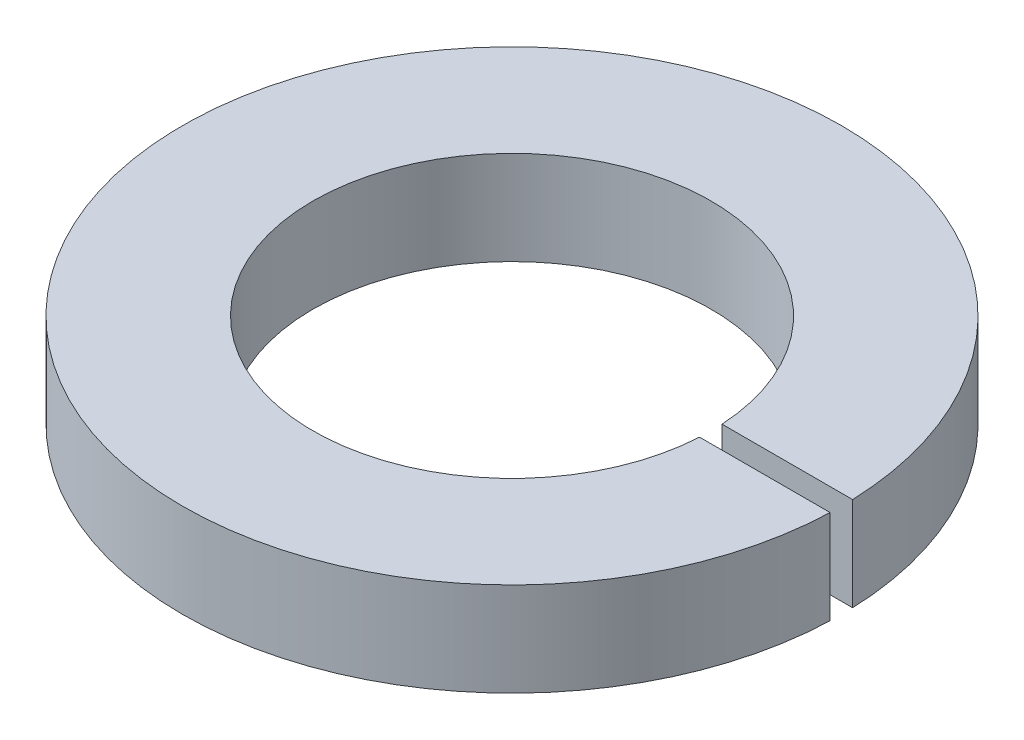
ISO-10303-21;
HEADER;
FILE_DESCRIPTION(('STEP AP214'),'2;1');
FILE_NAME('part.step','',(''),(''),'','','');
FILE_SCHEMA(('AUTOMOTIVE_DESIGN { 1 0 10303 214 1 1 1 1 }'));
ENDSEC;
DATA;
#1=APPLICATION_CONTEXT('core data for automotive mechanical design processes');
#2=APPLICATION_PROTOCOL_DEFINITION('international standard','automotive_design',2000,#1);
#3=PRODUCT_CONTEXT('',#1,'mechanical');
#4=PRODUCT('Part','Part','',(#3));
#5=PRODUCT_RELATED_PRODUCT_CATEGORY('part','',(#4));
#6=PRODUCT_DEFINITION_FORMATION('','',#4);
#7=PRODUCT_DEFINITION_CONTEXT('part definition',#1,'design');
#8=PRODUCT_DEFINITION('design','',#6,#7);
#9=PRODUCT_DEFINITION_SHAPE('','',#8);
#10=(LENGTH_UNIT() NAMED_UNIT(*) SI_UNIT(.MILLI.,.METRE.));
#11=(NAMED_UNIT(*) PLANE_ANGLE_UNIT() SI_UNIT($,.RADIAN.));
#12=(NAMED_UNIT(*) SI_UNIT($,.STERADIAN.) SOLID_ANGLE_UNIT());
#13=UNCERTAINTY_MEASURE_WITH_UNIT(LENGTH_MEASURE(1.E-05),#10,'distance_accuracy_value','');
#14=(GEOMETRIC_REPRESENTATION_CONTEXT(3) GLOBAL_UNCERTAINTY_ASSIGNED_CONTEXT((#13)) GLOBAL_UNIT_ASSIGNED_CONTEXT((#10,
#11,#12)) REPRESENTATION_CONTEXT('',''));
#15=CARTESIAN_POINT('',(0.,0.,0.));
#16=DIRECTION('',(0.,0.,1.));
#17=DIRECTION('',(1.,0.,0.));
#18=AXIS2_PLACEMENT_3D('',#15,#16,#17);
#19=CARTESIAN_POINT('',(0.,3.175,0.));
#20=DIRECTION('',(0.,1.,0.));
#21=DIRECTION('',(0.,0.,1.));
#22=AXIS2_PLACEMENT_3D('',#19,#20,#21);
#23=PLANE('',#22);
#24=CARTESIAN_POINT('',(0.,3.175,0.));
#25=DIRECTION('',(0.,1.,0.));
#26=DIRECTION('',(0.,0.,1.));
#27=AXIS2_PLACEMENT_3D('',#24,#25,#26);
#28=CIRCLE('',#27,11.1633);
#29=CARTESIAN_POINT('',(11.1567963990565,3.175,-0.380999999999999));
#30=VERTEX_POINT('',#29);
#31=CARTESIAN_POINT('',(11.1567963990565,3.175,0.381));
#32=VERTEX_POINT('',#31);
#33=EDGE_CURVE('E88',#30,#32,#28,.T.);
#34=ORIENTED_EDGE('',*,*,#33,.T.);
#35=DIRECTION('',(-1.,0.,0.));
#36=VECTOR('',#35,1.);
#37=CARTESIAN_POINT('',(11.1567963990565,3.175,0.381000000000001));
#38=LINE('',#37,#36);
#39=CARTESIAN_POINT('',(6.73292868594344,3.175,0.381000000000001));
#40=VERTEX_POINT('',#39);
#41=EDGE_CURVE('E101',#32,#40,#38,.T.);
#42=ORIENTED_EDGE('',*,*,#41,.T.);
#43=CARTESIAN_POINT('',(0.,3.175,0.));
#44=DIRECTION('',(0.,1.,0.));
#45=DIRECTION('',(0.,0.,1.));
#46=AXIS2_PLACEMENT_3D('',#43,#44,#45);
#47=CIRCLE('',#46,6.7437);
#48=CARTESIAN_POINT('',(6.73292868594344,3.175,-0.381));
#49=VERTEX_POINT('',#48);
#50=EDGE_CURVE('E92',#49,#40,#47,.T.);
#51=ORIENTED_EDGE('',*,*,#50,.F.);
#52=DIRECTION('',(-1.,0.,0.));
#53=VECTOR('',#52,1.);
#54=CARTESIAN_POINT('',(11.1567963990565,3.175,-0.380999999999999));
#55=LINE('',#54,#53);
#56=EDGE_CURVE('E56',#30,#49,#55,.T.);
#57=ORIENTED_EDGE('',*,*,#56,.F.);
#58=EDGE_LOOP('',(#34,#42,#51,#57));
#59=FACE_BOUND('',#58,.T.);
#60=ADVANCED_FACE('F34',(#59),#23,.T.);
#61=CARTESIAN_POINT('',(0.,0.,0.));
#62=DIRECTION('',(0.,1.,0.));
#63=DIRECTION('',(0.,0.,1.));
#64=AXIS2_PLACEMENT_3D('',#61,#62,#63);
#65=PLANE('',#64);
#66=DIRECTION('',(-1.,0.,0.));
#67=VECTOR('',#66,1.);
#68=CARTESIAN_POINT('',(11.1567963990565,0.,0.381000000000001));
#69=LINE('',#68,#67);
#70=CARTESIAN_POINT('',(11.1567963990565,0.,0.381));
#71=VERTEX_POINT('',#70);
#72=CARTESIAN_POINT('',(6.73292868594344,0.,0.381000000000001));
#73=VERTEX_POINT('',#72);
#74=EDGE_CURVE('E49',#71,#73,#69,.T.);
#75=ORIENTED_EDGE('',*,*,#74,.F.);
#76=CARTESIAN_POINT('',(0.,0.,0.));
#77=DIRECTION('',(0.,1.,0.));
#78=DIRECTION('',(0.,0.,1.));
#79=AXIS2_PLACEMENT_3D('',#76,#77,#78);
#80=CIRCLE('',#79,11.1633);
#81=CARTESIAN_POINT('',(11.1567963990565,0.,-0.380999999999999));
#82=VERTEX_POINT('',#81);
#83=EDGE_CURVE('E86',#82,#71,#80,.T.);
#84=ORIENTED_EDGE('',*,*,#83,.F.);
#85=DIRECTION('',(-1.,0.,0.));
#86=VECTOR('',#85,1.);
#87=CARTESIAN_POINT('',(11.1567963990565,0.,-0.380999999999999));
#88=LINE('',#87,#86);
#89=CARTESIAN_POINT('',(6.73292868594344,0.,-0.381));
#90=VERTEX_POINT('',#89);
#91=EDGE_CURVE('E72',#82,#90,#88,.T.);
#92=ORIENTED_EDGE('',*,*,#91,.T.);
#93=CARTESIAN_POINT('',(0.,0.,0.));
#94=DIRECTION('',(0.,1.,0.));
#95=DIRECTION('',(0.,0.,1.));
#96=AXIS2_PLACEMENT_3D('',#93,#94,#95);
#97=CIRCLE('',#96,6.7437);
#98=EDGE_CURVE('E89',#90,#73,#97,.T.);
#99=ORIENTED_EDGE('',*,*,#98,.T.);
#100=EDGE_LOOP('',(#75,#84,#92,#99));
#101=FACE_BOUND('',#100,.T.);
#102=ADVANCED_FACE('F91',(#101),#65,.F.);
#103=CARTESIAN_POINT('',(0.,3.175,0.));
#104=DIRECTION('',(0.,-1.,0.));
#105=DIRECTION('',(0.,0.,-1.));
#106=AXIS2_PLACEMENT_3D('',#103,#104,#105);
#107=CYLINDRICAL_SURFACE('',#106,11.1633);
#108=DIRECTION('',(0.,1.,0.));
#109=VECTOR('',#108,1.);
#110=CARTESIAN_POINT('',(11.1567963990565,0.,0.381));
#111=LINE('',#110,#109);
#112=EDGE_CURVE('E80',#71,#32,#111,.T.);
#113=ORIENTED_EDGE('',*,*,#112,.T.);
#114=ORIENTED_EDGE('',*,*,#33,.F.);
#115=DIRECTION('',(0.,1.,0.));
#116=VECTOR('',#115,1.);
#117=CARTESIAN_POINT('',(11.1567963990565,0.,-0.380999999999999));
#118=LINE('',#117,#116);
#119=EDGE_CURVE('E75',#82,#30,#118,.T.);
#120=ORIENTED_EDGE('',*,*,#119,.F.);
#121=ORIENTED_EDGE('',*,*,#83,.T.);
#122=EDGE_LOOP('',(#113,#114,#120,#121));
#123=FACE_BOUND('',#122,.T.);
#124=ADVANCED_FACE('F36',(#123),#107,.T.);
#125=CARTESIAN_POINT('',(0.,3.175,0.));
#126=DIRECTION('',(0.,-1.,0.));
#127=DIRECTION('',(0.,0.,-1.));
#128=AXIS2_PLACEMENT_3D('',#125,#126,#127);
#129=CYLINDRICAL_SURFACE('',#128,6.7437);
#130=ORIENTED_EDGE('',*,*,#50,.T.);
#131=DIRECTION('',(0.,-1.,0.));
#132=VECTOR('',#131,1.);
#133=CARTESIAN_POINT('',(6.73292868594344,3.175,0.381000000000001));
#134=LINE('',#133,#132);
#135=EDGE_CURVE('E11',#40,#73,#134,.T.);
#136=ORIENTED_EDGE('',*,*,#135,.T.);
#137=ORIENTED_EDGE('',*,*,#98,.F.);
#138=DIRECTION('',(0.,-1.,0.));
#139=VECTOR('',#138,1.);
#140=CARTESIAN_POINT('',(6.73292868594344,3.175,-0.381));
#141=LINE('',#140,#139);
#142=EDGE_CURVE('E42',#49,#90,#141,.T.);
#143=ORIENTED_EDGE('',*,*,#142,.F.);
#144=EDGE_LOOP('',(#130,#136,#137,#143));
#145=FACE_BOUND('',#144,.T.);
#146=ADVANCED_FACE('F107',(#145),#129,.F.);
#147=CARTESIAN_POINT('',(11.1567963990565,0.,-0.380999999999999));
#148=DIRECTION('',(0.,0.,-1.));
#149=DIRECTION('',(-1.,0.,0.));
#150=AXIS2_PLACEMENT_3D('',#147,#148,#149);
#151=PLANE('',#150);
#152=ORIENTED_EDGE('',*,*,#142,.T.);
#153=ORIENTED_EDGE('',*,*,#91,.F.);
#154=ORIENTED_EDGE('',*,*,#119,.T.);
#155=ORIENTED_EDGE('',*,*,#56,.T.);
#156=EDGE_LOOP('',(#152,#153,#154,#155));
#157=FACE_BOUND('',#156,.T.);
#158=ADVANCED_FACE('F74',(#157),#151,.F.);
#159=CARTESIAN_POINT('',(11.1567963990565,0.,0.381000000000001));
#160=DIRECTION('',(0.,0.,-1.));
#161=DIRECTION('',(-1.,0.,0.));
#162=AXIS2_PLACEMENT_3D('',#159,#160,#161);
#163=PLANE('',#162);
#164=ORIENTED_EDGE('',*,*,#41,.F.);
#165=ORIENTED_EDGE('',*,*,#112,.F.);
#166=ORIENTED_EDGE('',*,*,#74,.T.);
#167=ORIENTED_EDGE('',*,*,#135,.F.);
#168=EDGE_LOOP('',(#164,#165,#166,#167));
#169=FACE_BOUND('',#168,.T.);
#170=ADVANCED_FACE('F108',(#169),#163,.T.);
#171=CLOSED_SHELL('',(#60,#102,#124,#146,#158,#170));
#172=MANIFOLD_SOLID_BREP('B2',#171);
#173=ADVANCED_BREP_SHAPE_REPRESENTATION('',(#18,#172),#14);
#174=SHAPE_DEFINITION_REPRESENTATION(#9,#173);
ENDSEC;
END-ISO-10303-21;
